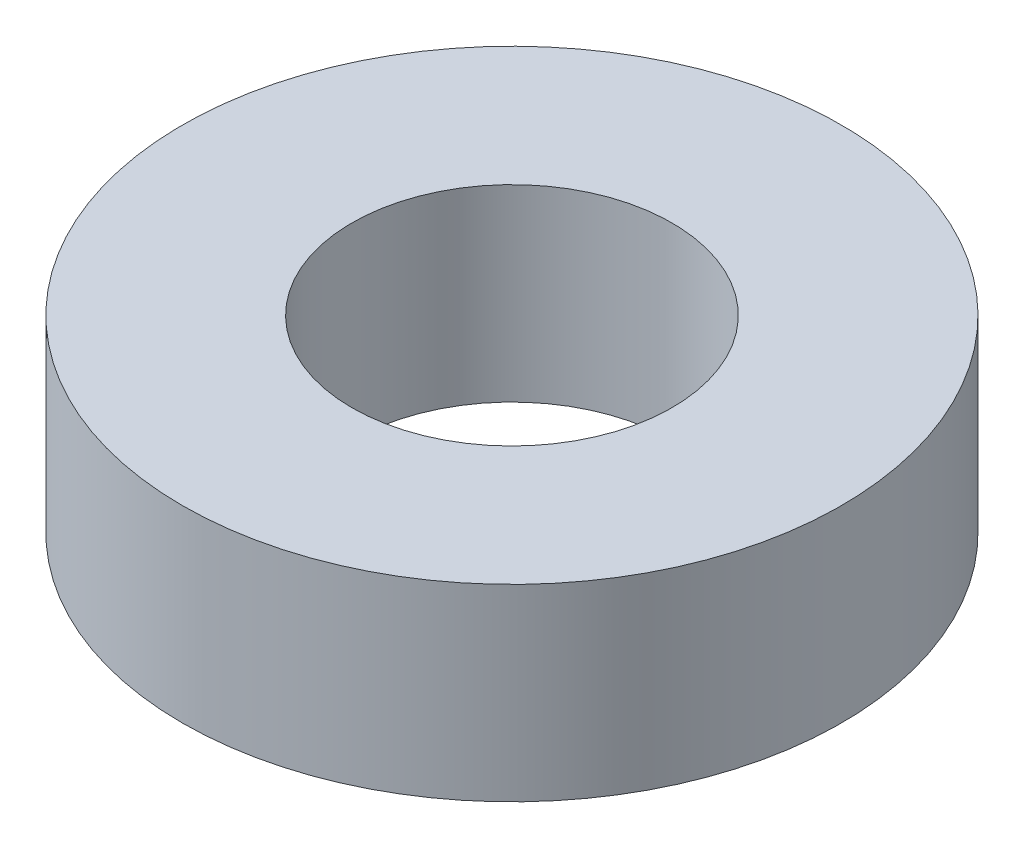
ISO-10303-21;
HEADER;
FILE_DESCRIPTION(('STEP AP214'),'2;1');
FILE_NAME('part.step','',(''),(''),'','','');
FILE_SCHEMA(('AUTOMOTIVE_DESIGN { 1 0 10303 214 1 1 1 1 }'));
ENDSEC;
DATA;
#1=APPLICATION_CONTEXT('core data for automotive mechanical design processes');
#2=APPLICATION_PROTOCOL_DEFINITION('international standard','automotive_design',2000,#1);
#3=PRODUCT_CONTEXT('',#1,'mechanical');
#4=PRODUCT('Part','Part','',(#3));
#5=PRODUCT_RELATED_PRODUCT_CATEGORY('part','',(#4));
#6=PRODUCT_DEFINITION_FORMATION('','',#4);
#7=PRODUCT_DEFINITION_CONTEXT('part definition',#1,'design');
#8=PRODUCT_DEFINITION('design','',#6,#7);
#9=PRODUCT_DEFINITION_SHAPE('','',#8);
#10=(LENGTH_UNIT() NAMED_UNIT(*) SI_UNIT(.MILLI.,.METRE.));
#11=(NAMED_UNIT(*) PLANE_ANGLE_UNIT() SI_UNIT($,.RADIAN.));
#12=(NAMED_UNIT(*) SI_UNIT($,.STERADIAN.) SOLID_ANGLE_UNIT());
#13=UNCERTAINTY_MEASURE_WITH_UNIT(LENGTH_MEASURE(1.E-05),#10,'distance_accuracy_value','');
#14=(GEOMETRIC_REPRESENTATION_CONTEXT(3) GLOBAL_UNCERTAINTY_ASSIGNED_CONTEXT((#13)) GLOBAL_UNIT_ASSIGNED_CONTEXT((#10,
#11,#12)) REPRESENTATION_CONTEXT('',''));
#15=CARTESIAN_POINT('',(0.,0.,0.));
#16=DIRECTION('',(0.,0.,1.));
#17=DIRECTION('',(1.,0.,0.));
#18=AXIS2_PLACEMENT_3D('',#15,#16,#17);
#19=CARTESIAN_POINT('',(0.,10.,0.));
#20=DIRECTION('',(0.,1.,0.));
#21=DIRECTION('',(0.,0.,1.));
#22=AXIS2_PLACEMENT_3D('',#19,#20,#21);
#23=PLANE('',#22);
#24=CARTESIAN_POINT('',(0.,10.,0.));
#25=DIRECTION('',(0.,1.,0.));
#26=DIRECTION('',(0.,0.,1.));
#27=AXIS2_PLACEMENT_3D('',#24,#25,#26);
#28=CIRCLE('',#27,17.5);
#29=CARTESIAN_POINT('',(0.,10.,17.5));
#30=VERTEX_POINT('',#29);
#31=EDGE_CURVE('E10',#30,#30,#28,.T.);
#32=ORIENTED_EDGE('',*,*,#31,.T.);
#33=EDGE_LOOP('',(#32));
#34=FACE_BOUND('',#33,.T.);
#35=CARTESIAN_POINT('',(0.,10.,0.));
#36=DIRECTION('',(0.,1.,0.));
#37=DIRECTION('',(0.,0.,1.));
#38=AXIS2_PLACEMENT_3D('',#35,#36,#37);
#39=CIRCLE('',#38,8.5);
#40=CARTESIAN_POINT('',(0.,10.,8.5));
#41=VERTEX_POINT('',#40);
#42=EDGE_CURVE('E39',#41,#41,#39,.T.);
#43=ORIENTED_EDGE('',*,*,#42,.F.);
#44=EDGE_LOOP('',(#43));
#45=FACE_BOUND('',#44,.T.);
#46=ADVANCED_FACE('F28',(#34,#45),#23,.T.);
#47=CARTESIAN_POINT('',(0.,0.,0.));
#48=DIRECTION('',(0.,1.,0.));
#49=DIRECTION('',(0.,0.,1.));
#50=AXIS2_PLACEMENT_3D('',#47,#48,#49);
#51=PLANE('',#50);
#52=CARTESIAN_POINT('',(0.,0.,0.));
#53=DIRECTION('',(0.,1.,0.));
#54=DIRECTION('',(0.,0.,1.));
#55=AXIS2_PLACEMENT_3D('',#52,#53,#54);
#56=CIRCLE('',#55,17.5);
#57=CARTESIAN_POINT('',(0.,0.,17.5));
#58=VERTEX_POINT('',#57);
#59=EDGE_CURVE('E32',#58,#58,#56,.T.);
#60=ORIENTED_EDGE('',*,*,#59,.F.);
#61=EDGE_LOOP('',(#60));
#62=FACE_BOUND('',#61,.T.);
#63=CARTESIAN_POINT('',(0.,0.,0.));
#64=DIRECTION('',(0.,1.,0.));
#65=DIRECTION('',(0.,0.,1.));
#66=AXIS2_PLACEMENT_3D('',#63,#64,#65);
#67=CIRCLE('',#66,8.5);
#68=CARTESIAN_POINT('',(0.,0.,8.5));
#69=VERTEX_POINT('',#68);
#70=EDGE_CURVE('E41',#69,#69,#67,.T.);
#71=ORIENTED_EDGE('',*,*,#70,.T.);
#72=EDGE_LOOP('',(#71));
#73=FACE_BOUND('',#72,.T.);
#74=ADVANCED_FACE('F51',(#62,#73),#51,.F.);
#75=CARTESIAN_POINT('',(0.,10.,0.));
#76=DIRECTION('',(0.,-1.,0.));
#77=DIRECTION('',(0.,0.,-1.));
#78=AXIS2_PLACEMENT_3D('',#75,#76,#77);
#79=CYLINDRICAL_SURFACE('',#78,17.5);
#80=ORIENTED_EDGE('',*,*,#31,.F.);
#81=EDGE_LOOP('',(#80));
#82=FACE_BOUND('',#81,.T.);
#83=ORIENTED_EDGE('',*,*,#59,.T.);
#84=EDGE_LOOP('',(#83));
#85=FACE_BOUND('',#84,.T.);
#86=ADVANCED_FACE('F30',(#82,#85),#79,.T.);
#87=CARTESIAN_POINT('',(0.,10.,0.));
#88=DIRECTION('',(0.,-1.,0.));
#89=DIRECTION('',(0.,0.,-1.));
#90=AXIS2_PLACEMENT_3D('',#87,#88,#89);
#91=CYLINDRICAL_SURFACE('',#90,8.5);
#92=ORIENTED_EDGE('',*,*,#42,.T.);
#93=EDGE_LOOP('',(#92));
#94=FACE_BOUND('',#93,.T.);
#95=ORIENTED_EDGE('',*,*,#70,.F.);
#96=EDGE_LOOP('',(#95));
#97=FACE_BOUND('',#96,.T.);
#98=ADVANCED_FACE('F47',(#94,#97),#91,.F.);
#99=CLOSED_SHELL('',(#46,#74,#86,#98));
#100=MANIFOLD_SOLID_BREP('B2',#99);
#101=ADVANCED_BREP_SHAPE_REPRESENTATION('',(#18,#100),#14);
#102=SHAPE_DEFINITION_REPRESENTATION(#9,#101);
ENDSEC;
END-ISO-10303-21;
